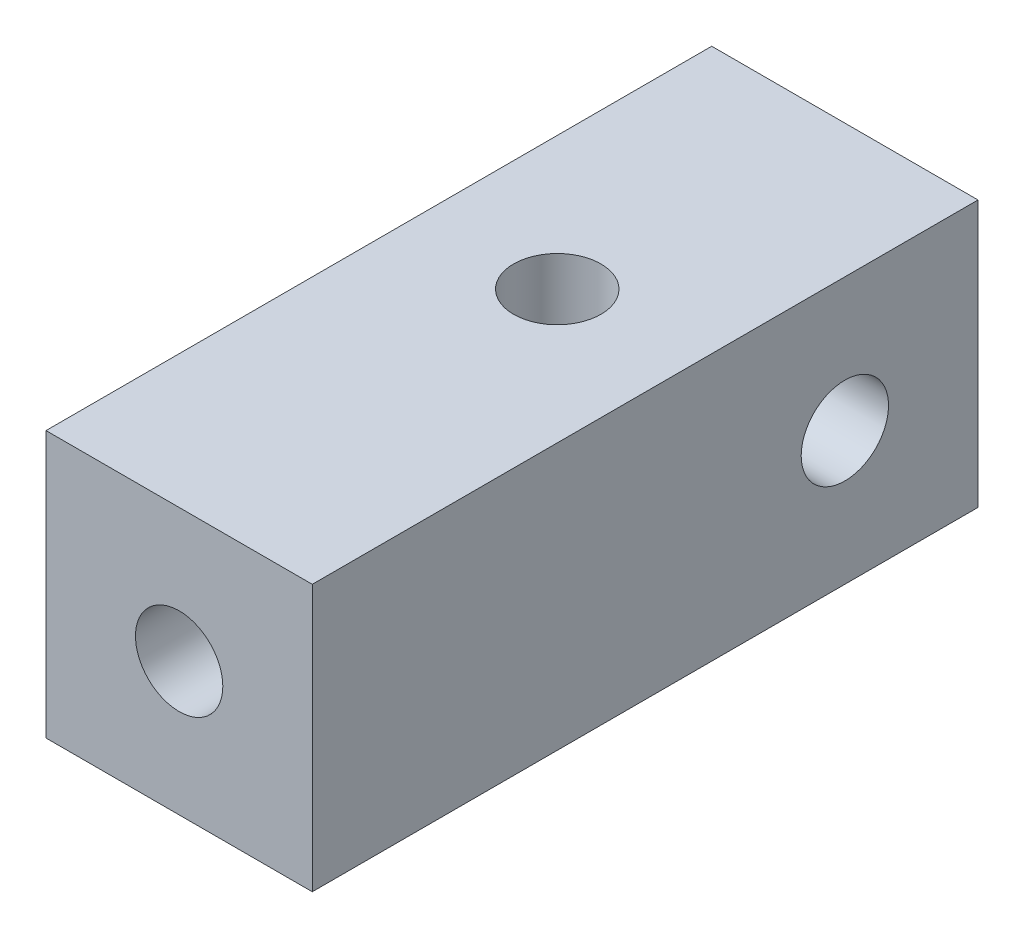
ISO-10303-21;
HEADER;
FILE_DESCRIPTION(('STEP AP214'),'2;1');
FILE_NAME('part.step','',(''),(''),'','','');
FILE_SCHEMA(('AUTOMOTIVE_DESIGN { 1 0 10303 214 1 1 1 1 }'));
ENDSEC;
DATA;
#1=APPLICATION_CONTEXT('core data for automotive mechanical design processes');
#2=APPLICATION_PROTOCOL_DEFINITION('international standard','automotive_design',2000,#1);
#3=PRODUCT_CONTEXT('',#1,'mechanical');
#4=PRODUCT('Part','Part','',(#3));
#5=PRODUCT_RELATED_PRODUCT_CATEGORY('part','',(#4));
#6=PRODUCT_DEFINITION_FORMATION('','',#4);
#7=PRODUCT_DEFINITION_CONTEXT('part definition',#1,'design');
#8=PRODUCT_DEFINITION('design','',#6,#7);
#9=PRODUCT_DEFINITION_SHAPE('','',#8);
#10=(LENGTH_UNIT() NAMED_UNIT(*) SI_UNIT(.MILLI.,.METRE.));
#11=(NAMED_UNIT(*) PLANE_ANGLE_UNIT() SI_UNIT($,.RADIAN.));
#12=(NAMED_UNIT(*) SI_UNIT($,.STERADIAN.) SOLID_ANGLE_UNIT());
#13=UNCERTAINTY_MEASURE_WITH_UNIT(LENGTH_MEASURE(1.E-05),#10,'distance_accuracy_value','');
#14=(GEOMETRIC_REPRESENTATION_CONTEXT(3) GLOBAL_UNCERTAINTY_ASSIGNED_CONTEXT((#13)) GLOBAL_UNIT_ASSIGNED_CONTEXT((#10,
#11,#12)) REPRESENTATION_CONTEXT('',''));
#15=CARTESIAN_POINT('',(0.,0.,0.));
#16=DIRECTION('',(0.,0.,1.));
#17=DIRECTION('',(1.,0.,0.));
#18=AXIS2_PLACEMENT_3D('',#15,#16,#17);
#19=CARTESIAN_POINT('',(0.,12.7,0.));
#20=DIRECTION('',(0.,-1.,0.));
#21=DIRECTION('',(0.,0.,-1.));
#22=AXIS2_PLACEMENT_3D('',#19,#20,#21);
#23=PLANE('',#22);
#24=DIRECTION('',(1.,0.,0.));
#25=VECTOR('',#24,1.);
#26=CARTESIAN_POINT('',(12.7,12.7,0.));
#27=LINE('',#26,#25);
#28=CARTESIAN_POINT('',(0.,12.7,0.));
#29=VERTEX_POINT('',#28);
#30=CARTESIAN_POINT('',(12.7,12.7,0.));
#31=VERTEX_POINT('',#30);
#32=EDGE_CURVE('E84',#29,#31,#27,.T.);
#33=ORIENTED_EDGE('',*,*,#32,.T.);
#34=DIRECTION('',(0.,0.,-1.));
#35=VECTOR('',#34,1.);
#36=CARTESIAN_POINT('',(12.7,12.7,-31.75));
#37=LINE('',#36,#35);
#38=CARTESIAN_POINT('',(12.7,12.7,-31.75));
#39=VERTEX_POINT('',#38);
#40=EDGE_CURVE('E79',#31,#39,#37,.T.);
#41=ORIENTED_EDGE('',*,*,#40,.T.);
#42=DIRECTION('',(-1.,0.,0.));
#43=VECTOR('',#42,1.);
#44=CARTESIAN_POINT('',(0.,12.7,-31.75));
#45=LINE('',#44,#43);
#46=CARTESIAN_POINT('',(0.,12.7,-31.75));
#47=VERTEX_POINT('',#46);
#48=EDGE_CURVE('E82',#39,#47,#45,.T.);
#49=ORIENTED_EDGE('',*,*,#48,.T.);
#50=DIRECTION('',(0.,0.,1.));
#51=VECTOR('',#50,1.);
#52=CARTESIAN_POINT('',(0.,12.7,0.));
#53=LINE('',#52,#51);
#54=EDGE_CURVE('E49',#47,#29,#53,.T.);
#55=ORIENTED_EDGE('',*,*,#54,.T.);
#56=EDGE_LOOP('',(#33,#41,#49,#55));
#57=FACE_BOUND('',#56,.T.);
#58=CARTESIAN_POINT('',(6.35,12.7,-18.034));
#59=DIRECTION('',(0.,1.,0.));
#60=DIRECTION('',(0.,0.,1.));
#61=AXIS2_PLACEMENT_3D('',#58,#59,#60);
#62=CIRCLE('',#61,2.0828);
#63=CARTESIAN_POINT('',(6.35,12.7,-15.9512));
#64=VERTEX_POINT('',#63);
#65=EDGE_CURVE('E99',#64,#64,#62,.T.);
#66=ORIENTED_EDGE('',*,*,#65,.F.);
#67=EDGE_LOOP('',(#66));
#68=FACE_BOUND('',#67,.T.);
#69=ADVANCED_FACE('F32',(#57,#68),#23,.F.);
#70=CARTESIAN_POINT('',(0.,0.,0.));
#71=DIRECTION('',(0.,-1.,0.));
#72=DIRECTION('',(0.,0.,-1.));
#73=AXIS2_PLACEMENT_3D('',#70,#71,#72);
#74=PLANE('',#73);
#75=DIRECTION('',(1.,0.,0.));
#76=VECTOR('',#75,1.);
#77=CARTESIAN_POINT('',(12.7,0.,0.));
#78=LINE('',#77,#76);
#79=CARTESIAN_POINT('',(0.,0.,0.));
#80=VERTEX_POINT('',#79);
#81=CARTESIAN_POINT('',(12.7,0.,0.));
#82=VERTEX_POINT('',#81);
#83=EDGE_CURVE('E96',#80,#82,#78,.T.);
#84=ORIENTED_EDGE('',*,*,#83,.F.);
#85=DIRECTION('',(0.,0.,1.));
#86=VECTOR('',#85,1.);
#87=CARTESIAN_POINT('',(0.,0.,0.));
#88=LINE('',#87,#86);
#89=CARTESIAN_POINT('',(0.,0.,-31.75));
#90=VERTEX_POINT('',#89);
#91=EDGE_CURVE('E72',#90,#80,#88,.T.);
#92=ORIENTED_EDGE('',*,*,#91,.F.);
#93=DIRECTION('',(-1.,0.,0.));
#94=VECTOR('',#93,1.);
#95=CARTESIAN_POINT('',(0.,0.,-31.75));
#96=LINE('',#95,#94);
#97=CARTESIAN_POINT('',(12.7,0.,-31.75));
#98=VERTEX_POINT('',#97);
#99=EDGE_CURVE('E66',#98,#90,#96,.T.);
#100=ORIENTED_EDGE('',*,*,#99,.F.);
#101=DIRECTION('',(0.,0.,-1.));
#102=VECTOR('',#101,1.);
#103=CARTESIAN_POINT('',(12.7,0.,-31.75));
#104=LINE('',#103,#102);
#105=EDGE_CURVE('E88',#82,#98,#104,.T.);
#106=ORIENTED_EDGE('',*,*,#105,.F.);
#107=EDGE_LOOP('',(#84,#92,#100,#106));
#108=FACE_BOUND('',#107,.T.);
#109=CARTESIAN_POINT('',(6.35,0.,-18.034));
#110=DIRECTION('',(0.,1.,0.));
#111=DIRECTION('',(0.,0.,1.));
#112=AXIS2_PLACEMENT_3D('',#109,#110,#111);
#113=CIRCLE('',#112,2.0828);
#114=CARTESIAN_POINT('',(6.35,0.,-15.9512));
#115=VERTEX_POINT('',#114);
#116=EDGE_CURVE('E111',#115,#115,#113,.T.);
#117=ORIENTED_EDGE('',*,*,#116,.T.);
#118=EDGE_LOOP('',(#117));
#119=FACE_BOUND('',#118,.T.);
#120=ADVANCED_FACE('F107',(#108,#119),#74,.T.);
#121=CARTESIAN_POINT('',(12.7,12.7,0.));
#122=DIRECTION('',(0.,0.,-1.));
#123=DIRECTION('',(-1.,0.,0.));
#124=AXIS2_PLACEMENT_3D('',#121,#122,#123);
#125=PLANE('',#124);
#126=CARTESIAN_POINT('',(6.35,6.35,0.));
#127=DIRECTION('',(0.,0.,1.));
#128=DIRECTION('',(1.,0.,0.));
#129=AXIS2_PLACEMENT_3D('',#126,#127,#128);
#130=CIRCLE('',#129,2.0828);
#131=CARTESIAN_POINT('',(8.4328,6.35,0.));
#132=VERTEX_POINT('',#131);
#133=EDGE_CURVE('E117',#132,#132,#130,.T.);
#134=ORIENTED_EDGE('',*,*,#133,.F.);
#135=EDGE_LOOP('',(#134));
#136=FACE_BOUND('',#135,.T.);
#137=ORIENTED_EDGE('',*,*,#83,.T.);
#138=DIRECTION('',(0.,-1.,0.));
#139=VECTOR('',#138,1.);
#140=CARTESIAN_POINT('',(12.7,12.7,0.));
#141=LINE('',#140,#139);
#142=EDGE_CURVE('E11',#31,#82,#141,.T.);
#143=ORIENTED_EDGE('',*,*,#142,.F.);
#144=ORIENTED_EDGE('',*,*,#32,.F.);
#145=DIRECTION('',(0.,-1.,0.));
#146=VECTOR('',#145,1.);
#147=CARTESIAN_POINT('',(0.,12.7,0.));
#148=LINE('',#147,#146);
#149=EDGE_CURVE('E92',#29,#80,#148,.T.);
#150=ORIENTED_EDGE('',*,*,#149,.T.);
#151=EDGE_LOOP('',(#137,#143,#144,#150));
#152=FACE_BOUND('',#151,.T.);
#153=ADVANCED_FACE('F34',(#136,#152),#125,.F.);
#154=CARTESIAN_POINT('',(12.7,12.7,-31.75));
#155=DIRECTION('',(-1.,0.,0.));
#156=DIRECTION('',(0.,0.,1.));
#157=AXIS2_PLACEMENT_3D('',#154,#155,#156);
#158=PLANE('',#157);
#159=CARTESIAN_POINT('',(12.7,6.35,-25.4));
#160=DIRECTION('',(-1.,0.,0.));
#161=DIRECTION('',(0.,0.,1.));
#162=AXIS2_PLACEMENT_3D('',#159,#160,#161);
#163=CIRCLE('',#162,2.0828);
#164=CARTESIAN_POINT('',(12.7,6.35,-23.3172));
#165=VERTEX_POINT('',#164);
#166=EDGE_CURVE('E120',#165,#165,#163,.T.);
#167=ORIENTED_EDGE('',*,*,#166,.T.);
#168=EDGE_LOOP('',(#167));
#169=FACE_BOUND('',#168,.T.);
#170=ORIENTED_EDGE('',*,*,#105,.T.);
#171=DIRECTION('',(0.,-1.,0.));
#172=VECTOR('',#171,1.);
#173=CARTESIAN_POINT('',(12.7,12.7,-31.75));
#174=LINE('',#173,#172);
#175=EDGE_CURVE('E41',#39,#98,#174,.T.);
#176=ORIENTED_EDGE('',*,*,#175,.F.);
#177=ORIENTED_EDGE('',*,*,#40,.F.);
#178=ORIENTED_EDGE('',*,*,#142,.T.);
#179=EDGE_LOOP('',(#170,#176,#177,#178));
#180=FACE_BOUND('',#179,.T.);
#181=ADVANCED_FACE('F87',(#169,#180),#158,.F.);
#182=CARTESIAN_POINT('',(0.,12.7,-31.75));
#183=DIRECTION('',(0.,0.,1.));
#184=DIRECTION('',(1.,0.,0.));
#185=AXIS2_PLACEMENT_3D('',#182,#183,#184);
#186=PLANE('',#185);
#187=ORIENTED_EDGE('',*,*,#99,.T.);
#188=DIRECTION('',(0.,-1.,0.));
#189=VECTOR('',#188,1.);
#190=CARTESIAN_POINT('',(0.,12.7,-31.75));
#191=LINE('',#190,#189);
#192=EDGE_CURVE('E89',#47,#90,#191,.T.);
#193=ORIENTED_EDGE('',*,*,#192,.F.);
#194=ORIENTED_EDGE('',*,*,#48,.F.);
#195=ORIENTED_EDGE('',*,*,#175,.T.);
#196=EDGE_LOOP('',(#187,#193,#194,#195));
#197=FACE_BOUND('',#196,.T.);
#198=ADVANCED_FACE('F90',(#197),#186,.F.);
#199=CARTESIAN_POINT('',(0.,12.7,0.));
#200=DIRECTION('',(1.,0.,0.));
#201=DIRECTION('',(0.,0.,-1.));
#202=AXIS2_PLACEMENT_3D('',#199,#200,#201);
#203=PLANE('',#202);
#204=CARTESIAN_POINT('',(0.,6.35,-25.4));
#205=DIRECTION('',(-1.,0.,0.));
#206=DIRECTION('',(0.,0.,1.));
#207=AXIS2_PLACEMENT_3D('',#204,#205,#206);
#208=CIRCLE('',#207,2.0828);
#209=CARTESIAN_POINT('',(0.,6.35,-23.3172));
#210=VERTEX_POINT('',#209);
#211=EDGE_CURVE('E123',#210,#210,#208,.T.);
#212=ORIENTED_EDGE('',*,*,#211,.F.);
#213=EDGE_LOOP('',(#212));
#214=FACE_BOUND('',#213,.T.);
#215=ORIENTED_EDGE('',*,*,#91,.T.);
#216=ORIENTED_EDGE('',*,*,#149,.F.);
#217=ORIENTED_EDGE('',*,*,#54,.F.);
#218=ORIENTED_EDGE('',*,*,#192,.T.);
#219=EDGE_LOOP('',(#215,#216,#217,#218));
#220=FACE_BOUND('',#219,.T.);
#221=ADVANCED_FACE('F104',(#214,#220),#203,.F.);
#222=CARTESIAN_POINT('',(6.35,12.7,-18.034));
#223=DIRECTION('',(0.,-1.,0.));
#224=DIRECTION('',(0.,0.,-1.));
#225=AXIS2_PLACEMENT_3D('',#222,#223,#224);
#226=CYLINDRICAL_SURFACE('',#225,2.0828);
#227=ORIENTED_EDGE('',*,*,#65,.T.);
#228=EDGE_LOOP('',(#227));
#229=FACE_BOUND('',#228,.T.);
#230=ORIENTED_EDGE('',*,*,#116,.F.);
#231=EDGE_LOOP('',(#230));
#232=FACE_BOUND('',#231,.T.);
#233=ADVANCED_FACE('F138',(#229,#232),#226,.F.);
#234=CARTESIAN_POINT('',(6.35,6.35,-12.7));
#235=DIRECTION('',(0.,0.,1.));
#236=DIRECTION('',(1.,0.,0.));
#237=AXIS2_PLACEMENT_3D('',#234,#235,#236);
#238=CYLINDRICAL_SURFACE('',#237,2.0828);
#239=CARTESIAN_POINT('',(6.35,6.35,-12.7));
#240=DIRECTION('',(0.,0.,1.));
#241=DIRECTION('',(1.,0.,0.));
#242=AXIS2_PLACEMENT_3D('',#239,#240,#241);
#243=CIRCLE('',#242,2.0828);
#244=CARTESIAN_POINT('',(8.4328,6.35,-12.7));
#245=VERTEX_POINT('',#244);
#246=EDGE_CURVE('E114',#245,#245,#243,.T.);
#247=ORIENTED_EDGE('',*,*,#246,.F.);
#248=EDGE_LOOP('',(#247));
#249=FACE_BOUND('',#248,.T.);
#250=ORIENTED_EDGE('',*,*,#133,.T.);
#251=EDGE_LOOP('',(#250));
#252=FACE_BOUND('',#251,.T.);
#253=ADVANCED_FACE('F144',(#249,#252),#238,.F.);
#254=CARTESIAN_POINT('',(6.35,6.35,-12.7));
#255=DIRECTION('',(0.,0.,1.));
#256=DIRECTION('',(1.,0.,0.));
#257=AXIS2_PLACEMENT_3D('',#254,#255,#256);
#258=PLANE('',#257);
#259=ORIENTED_EDGE('',*,*,#246,.T.);
#260=EDGE_LOOP('',(#259));
#261=FACE_BOUND('',#260,.T.);
#262=ADVANCED_FACE('F133',(#261),#258,.T.);
#263=CARTESIAN_POINT('',(12.7,6.35,-25.4));
#264=DIRECTION('',(-1.,0.,0.));
#265=DIRECTION('',(0.,0.,1.));
#266=AXIS2_PLACEMENT_3D('',#263,#264,#265);
#267=CYLINDRICAL_SURFACE('',#266,2.0828);
#268=ORIENTED_EDGE('',*,*,#166,.F.);
#269=EDGE_LOOP('',(#268));
#270=FACE_BOUND('',#269,.T.);
#271=ORIENTED_EDGE('',*,*,#211,.T.);
#272=EDGE_LOOP('',(#271));
#273=FACE_BOUND('',#272,.T.);
#274=ADVANCED_FACE('F130',(#270,#273),#267,.F.);
#275=CLOSED_SHELL('',(#69,#120,#153,#181,#198,#221,#233,#253,#262,#274));
#276=MANIFOLD_SOLID_BREP('B2',#275);
#277=ADVANCED_BREP_SHAPE_REPRESENTATION('',(#18,#276),#14);
#278=SHAPE_DEFINITION_REPRESENTATION(#9,#277);
ENDSEC;
END-ISO-10303-21;
